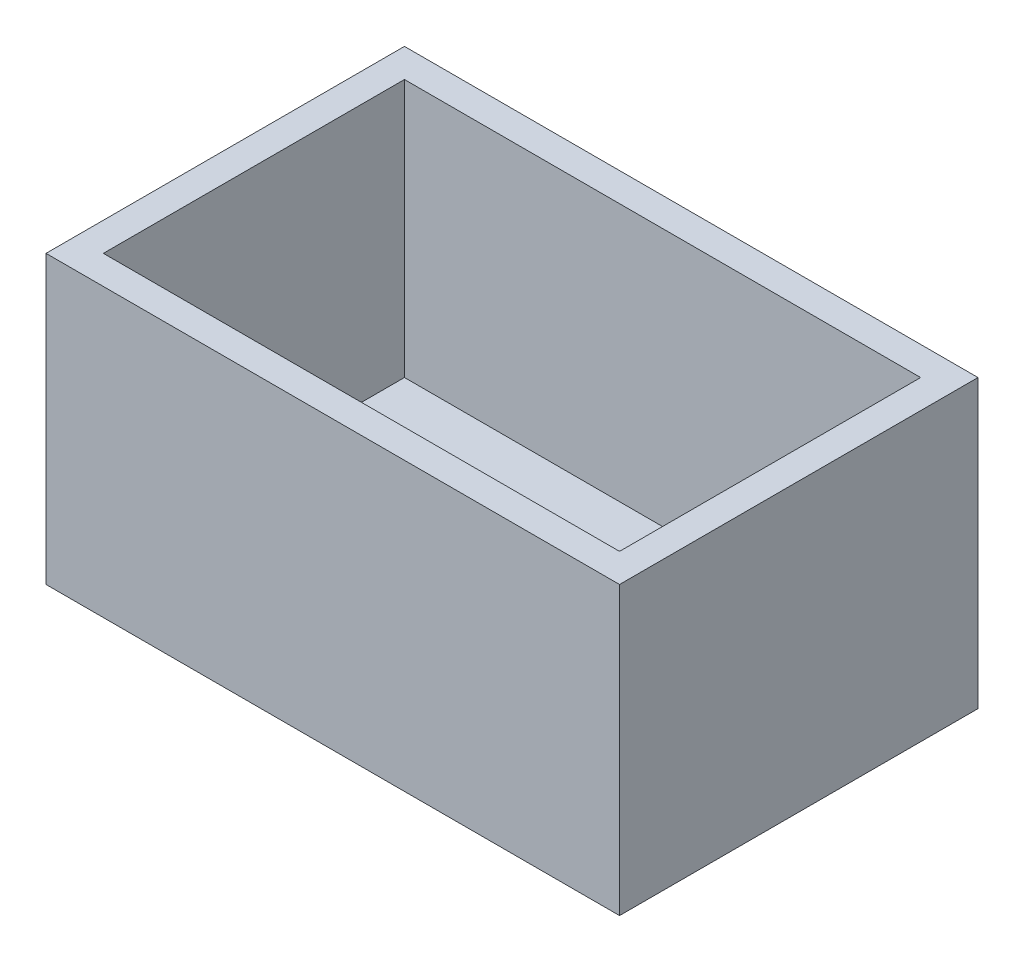
ISO-10303-21;
HEADER;
FILE_DESCRIPTION(('STEP AP214'),'2;1');
FILE_NAME('part.step','',(''),(''),'','','');
FILE_SCHEMA(('AUTOMOTIVE_DESIGN { 1 0 10303 214 1 1 1 1 }'));
ENDSEC;
DATA;
#1=APPLICATION_CONTEXT('core data for automotive mechanical design processes');
#2=APPLICATION_PROTOCOL_DEFINITION('international standard','automotive_design',2000,#1);
#3=PRODUCT_CONTEXT('',#1,'mechanical');
#4=PRODUCT('Part','Part','',(#3));
#5=PRODUCT_RELATED_PRODUCT_CATEGORY('part','',(#4));
#6=PRODUCT_DEFINITION_FORMATION('','',#4);
#7=PRODUCT_DEFINITION_CONTEXT('part definition',#1,'design');
#8=PRODUCT_DEFINITION('design','',#6,#7);
#9=PRODUCT_DEFINITION_SHAPE('','',#8);
#10=(LENGTH_UNIT() NAMED_UNIT(*) SI_UNIT(.MILLI.,.METRE.));
#11=(NAMED_UNIT(*) PLANE_ANGLE_UNIT() SI_UNIT($,.RADIAN.));
#12=(NAMED_UNIT(*) SI_UNIT($,.STERADIAN.) SOLID_ANGLE_UNIT());
#13=UNCERTAINTY_MEASURE_WITH_UNIT(LENGTH_MEASURE(1.E-05),#10,'distance_accuracy_value','');
#14=(GEOMETRIC_REPRESENTATION_CONTEXT(3) GLOBAL_UNCERTAINTY_ASSIGNED_CONTEXT((#13)) GLOBAL_UNIT_ASSIGNED_CONTEXT((#10,
#11,#12)) REPRESENTATION_CONTEXT('',''));
#15=CARTESIAN_POINT('',(0.,0.,0.));
#16=DIRECTION('',(0.,0.,1.));
#17=DIRECTION('',(1.,0.,0.));
#18=AXIS2_PLACEMENT_3D('',#15,#16,#17);
#19=CARTESIAN_POINT('',(0.,40.,0.));
#20=DIRECTION('',(0.,-1.,0.));
#21=DIRECTION('',(0.,0.,-1.));
#22=AXIS2_PLACEMENT_3D('',#19,#20,#21);
#23=PLANE('',#22);
#24=DIRECTION('',(0.,0.,1.));
#25=VECTOR('',#24,1.);
#26=CARTESIAN_POINT('',(-40.,40.,25.));
#27=LINE('',#26,#25);
#28=CARTESIAN_POINT('',(-40.,40.,-25.));
#29=VERTEX_POINT('',#28);
#30=CARTESIAN_POINT('',(-40.,40.,25.));
#31=VERTEX_POINT('',#30);
#32=EDGE_CURVE('E172',#29,#31,#27,.T.);
#33=ORIENTED_EDGE('',*,*,#32,.T.);
#34=DIRECTION('',(1.,0.,0.));
#35=VECTOR('',#34,1.);
#36=CARTESIAN_POINT('',(40.,40.,25.));
#37=LINE('',#36,#35);
#38=CARTESIAN_POINT('',(40.,40.,25.));
#39=VERTEX_POINT('',#38);
#40=EDGE_CURVE('E105',#31,#39,#37,.T.);
#41=ORIENTED_EDGE('',*,*,#40,.T.);
#42=DIRECTION('',(0.,0.,-1.));
#43=VECTOR('',#42,1.);
#44=CARTESIAN_POINT('',(40.,40.,-25.));
#45=LINE('',#44,#43);
#46=CARTESIAN_POINT('',(40.,40.,-25.));
#47=VERTEX_POINT('',#46);
#48=EDGE_CURVE('E177',#39,#47,#45,.T.);
#49=ORIENTED_EDGE('',*,*,#48,.T.);
#50=DIRECTION('',(-1.,0.,0.));
#51=VECTOR('',#50,1.);
#52=CARTESIAN_POINT('',(-40.,40.,-25.));
#53=LINE('',#52,#51);
#54=EDGE_CURVE('E77',#47,#29,#53,.T.);
#55=ORIENTED_EDGE('',*,*,#54,.T.);
#56=EDGE_LOOP('',(#33,#41,#49,#55));
#57=FACE_BOUND('',#56,.T.);
#58=DIRECTION('',(0.,0.,1.));
#59=VECTOR('',#58,1.);
#60=CARTESIAN_POINT('',(-36.,40.,0.));
#61=LINE('',#60,#59);
#62=CARTESIAN_POINT('',(-36.,40.,-21.));
#63=VERTEX_POINT('',#62);
#64=CARTESIAN_POINT('',(-36.,40.,21.));
#65=VERTEX_POINT('',#64);
#66=EDGE_CURVE('E156',#63,#65,#61,.T.);
#67=ORIENTED_EDGE('',*,*,#66,.F.);
#68=DIRECTION('',(-1.,0.,0.));
#69=VECTOR('',#68,1.);
#70=CARTESIAN_POINT('',(0.,40.,-21.));
#71=LINE('',#70,#69);
#72=CARTESIAN_POINT('',(36.,40.,-21.));
#73=VERTEX_POINT('',#72);
#74=EDGE_CURVE('E169',#73,#63,#71,.T.);
#75=ORIENTED_EDGE('',*,*,#74,.F.);
#76=DIRECTION('',(0.,0.,-1.));
#77=VECTOR('',#76,1.);
#78=CARTESIAN_POINT('',(36.,40.,0.));
#79=LINE('',#78,#77);
#80=CARTESIAN_POINT('',(36.,40.,21.));
#81=VERTEX_POINT('',#80);
#82=EDGE_CURVE('E166',#81,#73,#79,.T.);
#83=ORIENTED_EDGE('',*,*,#82,.F.);
#84=DIRECTION('',(1.,0.,0.));
#85=VECTOR('',#84,1.);
#86=CARTESIAN_POINT('',(0.,40.,21.));
#87=LINE('',#86,#85);
#88=EDGE_CURVE('E143',#65,#81,#87,.T.);
#89=ORIENTED_EDGE('',*,*,#88,.F.);
#90=EDGE_LOOP('',(#67,#75,#83,#89));
#91=FACE_BOUND('',#90,.T.);
#92=ADVANCED_FACE('F51',(#57,#91),#23,.F.);
#93=CARTESIAN_POINT('',(-40.,40.,25.));
#94=DIRECTION('',(1.,0.,0.));
#95=DIRECTION('',(0.,0.,-1.));
#96=AXIS2_PLACEMENT_3D('',#93,#94,#95);
#97=PLANE('',#96);
#98=DIRECTION('',(0.,0.,1.));
#99=VECTOR('',#98,1.);
#100=CARTESIAN_POINT('',(-40.,0.,25.));
#101=LINE('',#100,#99);
#102=CARTESIAN_POINT('',(-40.,0.,-25.));
#103=VERTEX_POINT('',#102);
#104=CARTESIAN_POINT('',(-40.,0.,25.));
#105=VERTEX_POINT('',#104);
#106=EDGE_CURVE('E182',#103,#105,#101,.T.);
#107=ORIENTED_EDGE('',*,*,#106,.T.);
#108=DIRECTION('',(0.,-1.,0.));
#109=VECTOR('',#108,1.);
#110=CARTESIAN_POINT('',(-40.,40.,25.));
#111=LINE('',#110,#109);
#112=EDGE_CURVE('E11',#31,#105,#111,.T.);
#113=ORIENTED_EDGE('',*,*,#112,.F.);
#114=ORIENTED_EDGE('',*,*,#32,.F.);
#115=DIRECTION('',(0.,-1.,0.));
#116=VECTOR('',#115,1.);
#117=CARTESIAN_POINT('',(-40.,40.,-25.));
#118=LINE('',#117,#116);
#119=EDGE_CURVE('E181',#29,#103,#118,.T.);
#120=ORIENTED_EDGE('',*,*,#119,.T.);
#121=EDGE_LOOP('',(#107,#113,#114,#120));
#122=FACE_BOUND('',#121,.T.);
#123=ADVANCED_FACE('F54',(#122),#97,.F.);
#124=CARTESIAN_POINT('',(40.,40.,25.));
#125=DIRECTION('',(0.,0.,-1.));
#126=DIRECTION('',(-1.,0.,0.));
#127=AXIS2_PLACEMENT_3D('',#124,#125,#126);
#128=PLANE('',#127);
#129=DIRECTION('',(1.,0.,0.));
#130=VECTOR('',#129,1.);
#131=CARTESIAN_POINT('',(40.,0.,25.));
#132=LINE('',#131,#130);
#133=CARTESIAN_POINT('',(40.,0.,25.));
#134=VERTEX_POINT('',#133);
#135=EDGE_CURVE('E185',#105,#134,#132,.T.);
#136=ORIENTED_EDGE('',*,*,#135,.T.);
#137=DIRECTION('',(0.,-1.,0.));
#138=VECTOR('',#137,1.);
#139=CARTESIAN_POINT('',(40.,40.,25.));
#140=LINE('',#139,#138);
#141=EDGE_CURVE('E61',#39,#134,#140,.T.);
#142=ORIENTED_EDGE('',*,*,#141,.F.);
#143=ORIENTED_EDGE('',*,*,#40,.F.);
#144=ORIENTED_EDGE('',*,*,#112,.T.);
#145=EDGE_LOOP('',(#136,#142,#143,#144));
#146=FACE_BOUND('',#145,.T.);
#147=ADVANCED_FACE('F218',(#146),#128,.F.);
#148=CARTESIAN_POINT('',(40.,40.,-25.));
#149=DIRECTION('',(-1.,0.,0.));
#150=DIRECTION('',(0.,0.,1.));
#151=AXIS2_PLACEMENT_3D('',#148,#149,#150);
#152=PLANE('',#151);
#153=DIRECTION('',(0.,0.,-1.));
#154=VECTOR('',#153,1.);
#155=CARTESIAN_POINT('',(40.,0.,-25.));
#156=LINE('',#155,#154);
#157=CARTESIAN_POINT('',(40.,0.,-25.));
#158=VERTEX_POINT('',#157);
#159=EDGE_CURVE('E188',#134,#158,#156,.T.);
#160=ORIENTED_EDGE('',*,*,#159,.T.);
#161=DIRECTION('',(0.,-1.,0.));
#162=VECTOR('',#161,1.);
#163=CARTESIAN_POINT('',(40.,40.,-25.));
#164=LINE('',#163,#162);
#165=EDGE_CURVE('E195',#47,#158,#164,.T.);
#166=ORIENTED_EDGE('',*,*,#165,.F.);
#167=ORIENTED_EDGE('',*,*,#48,.F.);
#168=ORIENTED_EDGE('',*,*,#141,.T.);
#169=EDGE_LOOP('',(#160,#166,#167,#168));
#170=FACE_BOUND('',#169,.T.);
#171=ADVANCED_FACE('F202',(#170),#152,.F.);
#172=CARTESIAN_POINT('',(-40.,40.,-25.));
#173=DIRECTION('',(0.,0.,1.));
#174=DIRECTION('',(1.,0.,0.));
#175=AXIS2_PLACEMENT_3D('',#172,#173,#174);
#176=PLANE('',#175);
#177=DIRECTION('',(-1.,0.,0.));
#178=VECTOR('',#177,1.);
#179=CARTESIAN_POINT('',(-40.,0.,-25.));
#180=LINE('',#179,#178);
#181=EDGE_CURVE('E98',#158,#103,#180,.T.);
#182=ORIENTED_EDGE('',*,*,#181,.T.);
#183=ORIENTED_EDGE('',*,*,#119,.F.);
#184=ORIENTED_EDGE('',*,*,#54,.F.);
#185=ORIENTED_EDGE('',*,*,#165,.T.);
#186=EDGE_LOOP('',(#182,#183,#184,#185));
#187=FACE_BOUND('',#186,.T.);
#188=ADVANCED_FACE('F210',(#187),#176,.F.);
#189=CARTESIAN_POINT('',(0.,0.,0.));
#190=DIRECTION('',(0.,-1.,0.));
#191=DIRECTION('',(0.,0.,-1.));
#192=AXIS2_PLACEMENT_3D('',#189,#190,#191);
#193=PLANE('',#192);
#194=ORIENTED_EDGE('',*,*,#106,.F.);
#195=ORIENTED_EDGE('',*,*,#181,.F.);
#196=ORIENTED_EDGE('',*,*,#159,.F.);
#197=ORIENTED_EDGE('',*,*,#135,.F.);
#198=EDGE_LOOP('',(#194,#195,#196,#197));
#199=FACE_BOUND('',#198,.T.);
#200=ADVANCED_FACE('F206',(#199),#193,.T.);
#201=CARTESIAN_POINT('',(-36.,40.,25.));
#202=DIRECTION('',(1.,0.,0.));
#203=DIRECTION('',(0.,0.,-1.));
#204=AXIS2_PLACEMENT_3D('',#201,#202,#203);
#205=PLANE('',#204);
#206=DIRECTION('',(0.,0.,1.));
#207=VECTOR('',#206,1.);
#208=CARTESIAN_POINT('',(-36.,4.,0.));
#209=LINE('',#208,#207);
#210=CARTESIAN_POINT('',(-36.,4.,-21.));
#211=VERTEX_POINT('',#210);
#212=CARTESIAN_POINT('',(-36.,4.,21.));
#213=VERTEX_POINT('',#212);
#214=EDGE_CURVE('E133',#211,#213,#209,.T.);
#215=ORIENTED_EDGE('',*,*,#214,.F.);
#216=DIRECTION('',(0.,-1.,0.));
#217=VECTOR('',#216,1.);
#218=CARTESIAN_POINT('',(-36.,40.,-21.));
#219=LINE('',#218,#217);
#220=EDGE_CURVE('E160',#63,#211,#219,.T.);
#221=ORIENTED_EDGE('',*,*,#220,.F.);
#222=ORIENTED_EDGE('',*,*,#66,.T.);
#223=DIRECTION('',(0.,-1.,0.));
#224=VECTOR('',#223,1.);
#225=CARTESIAN_POINT('',(-36.,40.,21.));
#226=LINE('',#225,#224);
#227=EDGE_CURVE('E147',#65,#213,#226,.T.);
#228=ORIENTED_EDGE('',*,*,#227,.T.);
#229=EDGE_LOOP('',(#215,#221,#222,#228));
#230=FACE_BOUND('',#229,.T.);
#231=ADVANCED_FACE('F216',(#230),#205,.T.);
#232=CARTESIAN_POINT('',(40.,40.,21.));
#233=DIRECTION('',(0.,0.,-1.));
#234=DIRECTION('',(-1.,0.,0.));
#235=AXIS2_PLACEMENT_3D('',#232,#233,#234);
#236=PLANE('',#235);
#237=DIRECTION('',(1.,0.,0.));
#238=VECTOR('',#237,1.);
#239=CARTESIAN_POINT('',(0.,4.,21.));
#240=LINE('',#239,#238);
#241=CARTESIAN_POINT('',(36.,4.,21.));
#242=VERTEX_POINT('',#241);
#243=EDGE_CURVE('E127',#213,#242,#240,.T.);
#244=ORIENTED_EDGE('',*,*,#243,.F.);
#245=ORIENTED_EDGE('',*,*,#227,.F.);
#246=ORIENTED_EDGE('',*,*,#88,.T.);
#247=DIRECTION('',(0.,-1.,0.));
#248=VECTOR('',#247,1.);
#249=CARTESIAN_POINT('',(36.,40.,21.));
#250=LINE('',#249,#248);
#251=EDGE_CURVE('E140',#81,#242,#250,.T.);
#252=ORIENTED_EDGE('',*,*,#251,.T.);
#253=EDGE_LOOP('',(#244,#245,#246,#252));
#254=FACE_BOUND('',#253,.T.);
#255=ADVANCED_FACE('F141',(#254),#236,.T.);
#256=CARTESIAN_POINT('',(36.,40.,-25.));
#257=DIRECTION('',(-1.,0.,0.));
#258=DIRECTION('',(0.,0.,1.));
#259=AXIS2_PLACEMENT_3D('',#256,#257,#258);
#260=PLANE('',#259);
#261=DIRECTION('',(0.,0.,-1.));
#262=VECTOR('',#261,1.);
#263=CARTESIAN_POINT('',(36.,4.,0.));
#264=LINE('',#263,#262);
#265=CARTESIAN_POINT('',(36.,4.,-21.));
#266=VERTEX_POINT('',#265);
#267=EDGE_CURVE('E131',#242,#266,#264,.T.);
#268=ORIENTED_EDGE('',*,*,#267,.F.);
#269=ORIENTED_EDGE('',*,*,#251,.F.);
#270=ORIENTED_EDGE('',*,*,#82,.T.);
#271=DIRECTION('',(0.,-1.,0.));
#272=VECTOR('',#271,1.);
#273=CARTESIAN_POINT('',(36.,40.,-21.));
#274=LINE('',#273,#272);
#275=EDGE_CURVE('E68',#73,#266,#274,.T.);
#276=ORIENTED_EDGE('',*,*,#275,.T.);
#277=EDGE_LOOP('',(#268,#269,#270,#276));
#278=FACE_BOUND('',#277,.T.);
#279=ADVANCED_FACE('F149',(#278),#260,.T.);
#280=CARTESIAN_POINT('',(-40.,40.,-21.));
#281=DIRECTION('',(0.,0.,1.));
#282=DIRECTION('',(1.,0.,0.));
#283=AXIS2_PLACEMENT_3D('',#280,#281,#282);
#284=PLANE('',#283);
#285=DIRECTION('',(-1.,0.,0.));
#286=VECTOR('',#285,1.);
#287=CARTESIAN_POINT('',(0.,4.,-21.));
#288=LINE('',#287,#286);
#289=EDGE_CURVE('E151',#266,#211,#288,.T.);
#290=ORIENTED_EDGE('',*,*,#289,.F.);
#291=ORIENTED_EDGE('',*,*,#275,.F.);
#292=ORIENTED_EDGE('',*,*,#74,.T.);
#293=ORIENTED_EDGE('',*,*,#220,.T.);
#294=EDGE_LOOP('',(#290,#291,#292,#293));
#295=FACE_BOUND('',#294,.T.);
#296=ADVANCED_FACE('F239',(#295),#284,.T.);
#297=CARTESIAN_POINT('',(0.,4.,0.));
#298=DIRECTION('',(0.,-1.,0.));
#299=DIRECTION('',(0.,0.,-1.));
#300=AXIS2_PLACEMENT_3D('',#297,#298,#299);
#301=PLANE('',#300);
#302=ORIENTED_EDGE('',*,*,#214,.T.);
#303=ORIENTED_EDGE('',*,*,#243,.T.);
#304=ORIENTED_EDGE('',*,*,#267,.T.);
#305=ORIENTED_EDGE('',*,*,#289,.T.);
#306=EDGE_LOOP('',(#302,#303,#304,#305));
#307=FACE_BOUND('',#306,.T.);
#308=ADVANCED_FACE('F129',(#307),#301,.F.);
#309=CLOSED_SHELL('',(#92,#123,#147,#171,#188,#200,#231,#255,#279,#296,#308));
#310=MANIFOLD_SOLID_BREP('B2',#309);
#311=ADVANCED_BREP_SHAPE_REPRESENTATION('',(#18,#310),#14);
#312=SHAPE_DEFINITION_REPRESENTATION(#9,#311);
ENDSEC;
END-ISO-10303-21;
